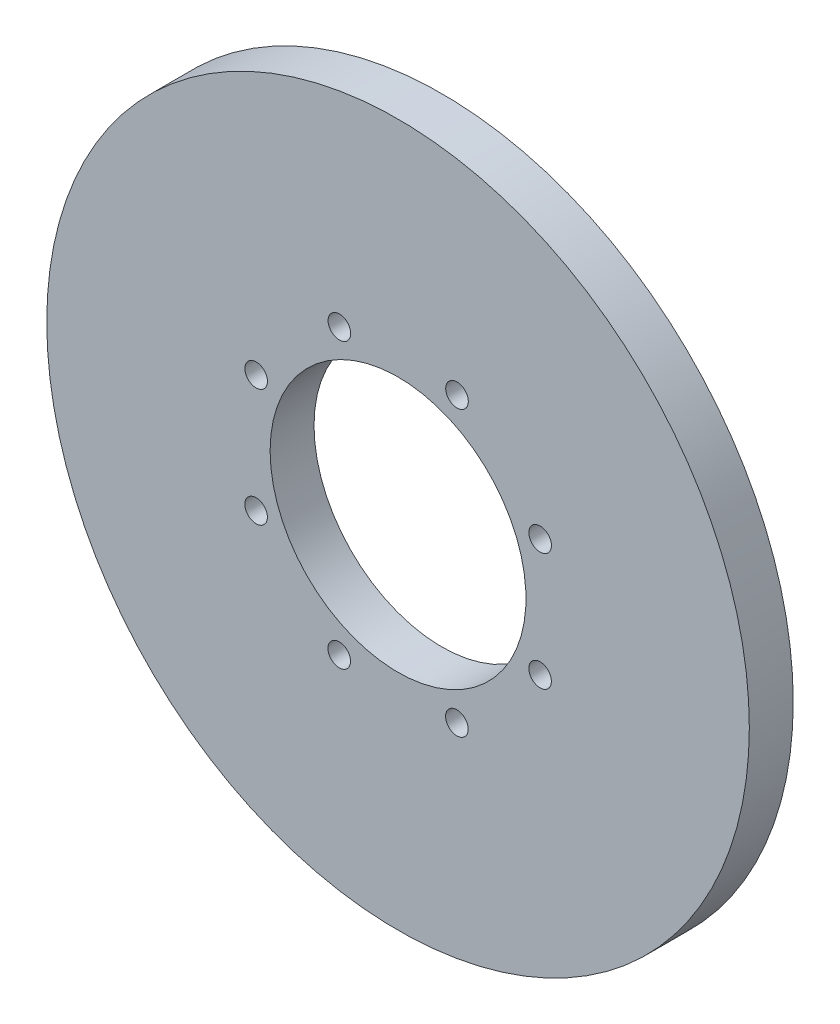
ISO-10303-21;
HEADER;
FILE_DESCRIPTION(('STEP AP214'),'2;1');
FILE_NAME('part.step','',(''),(''),'','','');
FILE_SCHEMA(('AUTOMOTIVE_DESIGN { 1 0 10303 214 1 1 1 1 }'));
ENDSEC;
DATA;
#1=APPLICATION_CONTEXT('core data for automotive mechanical design processes');
#2=APPLICATION_PROTOCOL_DEFINITION('international standard','automotive_design',2000,#1);
#3=PRODUCT_CONTEXT('',#1,'mechanical');
#4=PRODUCT('Part','Part','',(#3));
#5=PRODUCT_RELATED_PRODUCT_CATEGORY('part','',(#4));
#6=PRODUCT_DEFINITION_FORMATION('','',#4);
#7=PRODUCT_DEFINITION_CONTEXT('part definition',#1,'design');
#8=PRODUCT_DEFINITION('design','',#6,#7);
#9=PRODUCT_DEFINITION_SHAPE('','',#8);
#10=(LENGTH_UNIT() NAMED_UNIT(*) SI_UNIT(.MILLI.,.METRE.));
#11=(NAMED_UNIT(*) PLANE_ANGLE_UNIT() SI_UNIT($,.RADIAN.));
#12=(NAMED_UNIT(*) SI_UNIT($,.STERADIAN.) SOLID_ANGLE_UNIT());
#13=UNCERTAINTY_MEASURE_WITH_UNIT(LENGTH_MEASURE(1.E-05),#10,'distance_accuracy_value','');
#14=(GEOMETRIC_REPRESENTATION_CONTEXT(3) GLOBAL_UNCERTAINTY_ASSIGNED_CONTEXT((#13)) GLOBAL_UNIT_ASSIGNED_CONTEXT((#10,
#11,#12)) REPRESENTATION_CONTEXT('',''));
#15=CARTESIAN_POINT('',(0.,0.,0.));
#16=DIRECTION('',(0.,0.,1.));
#17=DIRECTION('',(1.,0.,0.));
#18=AXIS2_PLACEMENT_3D('',#15,#16,#17);
#19=CARTESIAN_POINT('',(0.,0.,19.05));
#20=DIRECTION('',(0.,0.,-1.));
#21=DIRECTION('',(-1.,0.,0.));
#22=AXIS2_PLACEMENT_3D('',#19,#20,#21);
#23=CYLINDRICAL_SURFACE('',#22,152.4);
#24=CARTESIAN_POINT('',(0.,0.,19.05));
#25=DIRECTION('',(0.,0.,1.));
#26=DIRECTION('',(1.,0.,0.));
#27=AXIS2_PLACEMENT_3D('',#24,#25,#26);
#28=CIRCLE('',#27,152.4);
#29=CARTESIAN_POINT('',(-152.4,0.,19.05));
#30=VERTEX_POINT('',#29);
#31=EDGE_CURVE('E11',#30,#30,#28,.T.);
#32=CARTESIAN_POINT('',(0.,0.,0.));
#33=DIRECTION('',(0.,0.,1.));
#34=DIRECTION('',(1.,0.,0.));
#35=AXIS2_PLACEMENT_3D('',#32,#33,#34);
#36=CIRCLE('',#35,152.4);
#37=CARTESIAN_POINT('',(-152.4,0.,0.));
#38=VERTEX_POINT('',#37);
#39=EDGE_CURVE('E40',#38,#38,#36,.T.);
#40=CARTESIAN_POINT('',(-152.4,0.,19.05));
#41=CARTESIAN_POINT('',(-152.4,0.,18.8515625));
#42=CARTESIAN_POINT('',(-152.4,0.,18.653125));
#43=CARTESIAN_POINT('',(-152.4,0.,18.25625));
#44=CARTESIAN_POINT('',(-152.4,0.,18.0578125));
#45=CARTESIAN_POINT('',(-152.4,0.,17.6609375));
#46=CARTESIAN_POINT('',(-152.4,0.,17.4625));
#47=CARTESIAN_POINT('',(-152.4,0.,17.065625));
#48=CARTESIAN_POINT('',(-152.4,0.,16.8671875));
#49=CARTESIAN_POINT('',(-152.4,0.,16.4703125));
#50=CARTESIAN_POINT('',(-152.4,0.,16.271875));
#51=CARTESIAN_POINT('',(-152.4,0.,15.875));
#52=CARTESIAN_POINT('',(-152.4,0.,15.6765625));
#53=CARTESIAN_POINT('',(-152.4,0.,15.2796875));
#54=CARTESIAN_POINT('',(-152.4,0.,15.08125));
#55=CARTESIAN_POINT('',(-152.4,0.,14.684375));
#56=CARTESIAN_POINT('',(-152.4,0.,14.4859375));
#57=CARTESIAN_POINT('',(-152.4,0.,14.0890625));
#58=CARTESIAN_POINT('',(-152.4,0.,13.890625));
#59=CARTESIAN_POINT('',(-152.4,0.,13.49375));
#60=CARTESIAN_POINT('',(-152.4,0.,13.2953125));
#61=CARTESIAN_POINT('',(-152.4,0.,12.8984375));
#62=CARTESIAN_POINT('',(-152.4,0.,12.7));
#63=CARTESIAN_POINT('',(-152.4,0.,12.303125));
#64=CARTESIAN_POINT('',(-152.4,0.,12.1046875));
#65=CARTESIAN_POINT('',(-152.4,0.,11.7078125));
#66=CARTESIAN_POINT('',(-152.4,0.,11.509375));
#67=CARTESIAN_POINT('',(-152.4,0.,11.1125));
#68=CARTESIAN_POINT('',(-152.4,0.,10.9140625));
#69=CARTESIAN_POINT('',(-152.4,0.,10.5171875));
#70=CARTESIAN_POINT('',(-152.4,0.,10.31875));
#71=CARTESIAN_POINT('',(-152.4,0.,9.921875));
#72=CARTESIAN_POINT('',(-152.4,0.,9.7234375));
#73=CARTESIAN_POINT('',(-152.4,0.,9.3265625));
#74=CARTESIAN_POINT('',(-152.4,0.,9.128125));
#75=CARTESIAN_POINT('',(-152.4,0.,8.73125));
#76=CARTESIAN_POINT('',(-152.4,0.,8.5328125));
#77=CARTESIAN_POINT('',(-152.4,0.,8.1359375));
#78=CARTESIAN_POINT('',(-152.4,0.,7.9375));
#79=CARTESIAN_POINT('',(-152.4,0.,7.540625));
#80=CARTESIAN_POINT('',(-152.4,0.,7.3421875));
#81=CARTESIAN_POINT('',(-152.4,0.,6.9453125));
#82=CARTESIAN_POINT('',(-152.4,0.,6.746875));
#83=CARTESIAN_POINT('',(-152.4,0.,6.35));
#84=CARTESIAN_POINT('',(-152.4,0.,6.1515625));
#85=CARTESIAN_POINT('',(-152.4,0.,5.7546875));
#86=CARTESIAN_POINT('',(-152.4,0.,5.55625));
#87=CARTESIAN_POINT('',(-152.4,0.,5.159375));
#88=CARTESIAN_POINT('',(-152.4,0.,4.9609375));
#89=CARTESIAN_POINT('',(-152.4,0.,4.5640625));
#90=CARTESIAN_POINT('',(-152.4,0.,4.365625));
#91=CARTESIAN_POINT('',(-152.4,0.,3.96875));
#92=CARTESIAN_POINT('',(-152.4,0.,3.7703125));
#93=CARTESIAN_POINT('',(-152.4,0.,3.3734375));
#94=CARTESIAN_POINT('',(-152.4,0.,3.175));
#95=CARTESIAN_POINT('',(-152.4,0.,2.778125));
#96=CARTESIAN_POINT('',(-152.4,0.,2.5796875));
#97=CARTESIAN_POINT('',(-152.4,0.,2.1828125));
#98=CARTESIAN_POINT('',(-152.4,0.,1.984375));
#99=CARTESIAN_POINT('',(-152.4,0.,1.5875));
#100=CARTESIAN_POINT('',(-152.4,0.,1.3890625));
#101=CARTESIAN_POINT('',(-152.4,0.,0.992187500000001));
#102=CARTESIAN_POINT('',(-152.4,0.,0.793750000000001));
#103=CARTESIAN_POINT('',(-152.4,0.,0.396875));
#104=CARTESIAN_POINT('',(-152.4,0.,0.1984375));
#105=CARTESIAN_POINT('',(-152.4,0.,0.));
#106=B_SPLINE_CURVE_WITH_KNOTS('',3,(#40,#41,#42,#43,#44,#45,#46,#47,#48,#49,#50,#51,#52,#53,
#54,#55,#56,#57,#58,#59,#60,#61,#62,#63,#64,#65,#66,#67,#68,#69,#70,#71,#72,#73,#74,#75,#76,#77,
#78,#79,#80,#81,#82,#83,#84,#85,#86,#87,#88,#89,#90,#91,#92,#93,#94,#95,#96,#97,#98,#99,#100,
#101,#102,#103,#104,#105),.UNSPECIFIED.,.F.,.F.,(4,2,2,2,2,2,2,2,2,2,2,2,2,2,2,2,2,2,2,2,2,2,2,
2,2,2,2,2,2,2,2,2,4),(0.,0.5953125,1.190625,1.7859375,2.38125,2.9765625,3.571875,4.1671875,
4.7625,5.3578125,5.953125,6.5484375,7.14375,7.7390625,8.334375,8.9296875,9.525,10.1203125,
10.715625,11.3109375,11.90625,12.5015625,13.096875,13.6921875,14.2875,14.8828125,15.478125,
16.0734375,16.66875,17.2640625,17.859375,18.4546875,19.05),.UNSPECIFIED.);
#107=EDGE_CURVE('BSEAM32',#30,#38,#106,.T.);
#108=ORIENTED_EDGE('',*,*,#31,.F.);
#109=ORIENTED_EDGE('',*,*,#39,.T.);
#110=ORIENTED_EDGE('',*,*,#107,.T.);
#111=ORIENTED_EDGE('',*,*,#107,.F.);
#112=EDGE_LOOP('',(#108,#110,#109,#111));
#113=FACE_BOUND('',#112,.T.);
#114=ADVANCED_FACE('F32',(#113),#23,.T.);
#115=CARTESIAN_POINT('',(0.,0.,19.05));
#116=DIRECTION('',(0.,0.,1.));
#117=DIRECTION('',(1.,0.,0.));
#118=AXIS2_PLACEMENT_3D('',#115,#116,#117);
#119=PLANE('',#118);
#120=CARTESIAN_POINT('',(25.5239739587026,-61.6730280447129,19.05));
#121=DIRECTION('',(0.,0.,1.));
#122=DIRECTION('',(1.,0.,0.));
#123=AXIS2_PLACEMENT_3D('',#120,#121,#122);
#124=CIRCLE('',#123,4.90219999999999);
#125=CARTESIAN_POINT('',(30.4261739587026,-61.6730280447129,19.05));
#126=VERTEX_POINT('',#125);
#127=EDGE_CURVE('E103',#126,#126,#124,.T.);
#128=ORIENTED_EDGE('',*,*,#127,.F.);
#129=EDGE_LOOP('',(#128));
#130=FACE_BOUND('',#129,.T.);
#131=CARTESIAN_POINT('',(61.6247346491195,-25.605296338737,19.05));
#132=DIRECTION('',(0.,0.,1.));
#133=DIRECTION('',(1.,0.,0.));
#134=AXIS2_PLACEMENT_3D('',#131,#132,#133);
#135=CIRCLE('',#134,4.90219999999998);
#136=CARTESIAN_POINT('',(66.5269346491195,-25.605296338737,19.05));
#137=VERTEX_POINT('',#136);
#138=EDGE_CURVE('E97',#137,#137,#135,.T.);
#139=ORIENTED_EDGE('',*,*,#138,.F.);
#140=EDGE_LOOP('',(#139));
#141=FACE_BOUND('',#140,.T.);
#142=CARTESIAN_POINT('',(61.6480896679934,25.4255340227622,19.05));
#143=DIRECTION('',(0.,0.,1.));
#144=DIRECTION('',(1.,0.,0.));
#145=AXIS2_PLACEMENT_3D('',#142,#143,#144);
#146=CIRCLE('',#145,4.90219999999999);
#147=CARTESIAN_POINT('',(66.5502896679934,25.4255340227622,19.05));
#148=VERTEX_POINT('',#147);
#149=EDGE_CURVE('E91',#148,#148,#146,.T.);
#150=ORIENTED_EDGE('',*,*,#149,.F.);
#151=EDGE_LOOP('',(#150));
#152=FACE_BOUND('',#151,.T.);
#153=CARTESIAN_POINT('',(25.5803579620182,61.5262947131786,19.05));
#154=DIRECTION('',(0.,0.,1.));
#155=DIRECTION('',(1.,0.,0.));
#156=AXIS2_PLACEMENT_3D('',#153,#154,#155);
#157=CIRCLE('',#156,4.90219999999999);
#158=CARTESIAN_POINT('',(30.4825579620182,61.5262947131786,19.05));
#159=VERTEX_POINT('',#158);
#160=EDGE_CURVE('E85',#159,#159,#157,.T.);
#161=ORIENTED_EDGE('',*,*,#160,.F.);
#162=EDGE_LOOP('',(#161));
#163=FACE_BOUND('',#162,.T.);
#164=CARTESIAN_POINT('',(-25.4504723994809,61.5496497320531,19.05));
#165=DIRECTION('',(0.,0.,1.));
#166=DIRECTION('',(1.,0.,0.));
#167=AXIS2_PLACEMENT_3D('',#164,#165,#166);
#168=CIRCLE('',#167,4.90219999999999);
#169=CARTESIAN_POINT('',(-20.5482723994809,61.5496497320531,19.05));
#170=VERTEX_POINT('',#169);
#171=EDGE_CURVE('E79',#170,#170,#168,.T.);
#172=ORIENTED_EDGE('',*,*,#171,.F.);
#173=EDGE_LOOP('',(#172));
#174=FACE_BOUND('',#173,.T.);
#175=CARTESIAN_POINT('',(-61.5512330898981,25.4819180260774,19.05));
#176=DIRECTION('',(0.,0.,1.));
#177=DIRECTION('',(1.,0.,0.));
#178=AXIS2_PLACEMENT_3D('',#175,#176,#177);
#179=CIRCLE('',#178,4.90219999999999);
#180=CARTESIAN_POINT('',(-56.6490330898981,25.4819180260774,19.05));
#181=VERTEX_POINT('',#180);
#182=EDGE_CURVE('E73',#181,#181,#179,.T.);
#183=ORIENTED_EDGE('',*,*,#182,.F.);
#184=EDGE_LOOP('',(#183));
#185=FACE_BOUND('',#184,.T.);
#186=CARTESIAN_POINT('',(-61.5745881087722,-25.5489123354222,19.05));
#187=DIRECTION('',(0.,0.,1.));
#188=DIRECTION('',(1.,0.,0.));
#189=AXIS2_PLACEMENT_3D('',#186,#187,#188);
#190=CIRCLE('',#189,4.90219999999999);
#191=CARTESIAN_POINT('',(-56.6723881087722,-25.5489123354222,19.05));
#192=VERTEX_POINT('',#191);
#193=EDGE_CURVE('E65',#192,#192,#190,.T.);
#194=ORIENTED_EDGE('',*,*,#193,.F.);
#195=EDGE_LOOP('',(#194));
#196=FACE_BOUND('',#195,.T.);
#197=CARTESIAN_POINT('',(-25.5068564027966,-61.6496730258388,19.05));
#198=DIRECTION('',(0.,0.,1.));
#199=DIRECTION('',(1.,0.,0.));
#200=AXIS2_PLACEMENT_3D('',#197,#198,#199);
#201=CIRCLE('',#200,4.90219999999999);
#202=CARTESIAN_POINT('',(-20.6046564027966,-61.6496730258388,19.05));
#203=VERTEX_POINT('',#202);
#204=EDGE_CURVE('E57',#203,#203,#201,.T.);
#205=ORIENTED_EDGE('',*,*,#204,.F.);
#206=EDGE_LOOP('',(#205));
#207=FACE_BOUND('',#206,.T.);
#208=CARTESIAN_POINT('',(0.,0.,19.05));
#209=DIRECTION('',(0.,0.,1.));
#210=DIRECTION('',(1.,0.,0.));
#211=AXIS2_PLACEMENT_3D('',#208,#209,#210);
#212=CIRCLE('',#211,55.5);
#213=CARTESIAN_POINT('',(-55.5,0.,19.05));
#214=VERTEX_POINT('',#213);
#215=EDGE_CURVE('E45',#214,#214,#212,.F.);
#216=ORIENTED_EDGE('',*,*,#215,.T.);
#217=EDGE_LOOP('',(#216));
#218=FACE_BOUND('',#217,.T.);
#219=ORIENTED_EDGE('',*,*,#31,.T.);
#220=EDGE_LOOP('',(#219));
#221=FACE_BOUND('',#220,.T.);
#222=ADVANCED_FACE('F109',(#130,#141,#152,#163,#174,#185,#196,#207,#218,#221),#119,.T.);
#223=CARTESIAN_POINT('',(0.,0.,0.));
#224=DIRECTION('',(0.,0.,1.));
#225=DIRECTION('',(1.,0.,0.));
#226=AXIS2_PLACEMENT_3D('',#223,#224,#225);
#227=PLANE('',#226);
#228=CARTESIAN_POINT('',(25.5239739587026,-61.6730280447129,0.));
#229=DIRECTION('',(0.,0.,1.));
#230=DIRECTION('',(1.,0.,0.));
#231=AXIS2_PLACEMENT_3D('',#228,#229,#230);
#232=CIRCLE('',#231,4.9022);
#233=CARTESIAN_POINT('',(30.4261739587026,-61.6730280447129,0.));
#234=VERTEX_POINT('',#233);
#235=EDGE_CURVE('E100',#234,#234,#232,.T.);
#236=ORIENTED_EDGE('',*,*,#235,.T.);
#237=EDGE_LOOP('',(#236));
#238=FACE_BOUND('',#237,.T.);
#239=CARTESIAN_POINT('',(61.6247346491195,-25.605296338737,0.));
#240=DIRECTION('',(0.,0.,1.));
#241=DIRECTION('',(1.,0.,0.));
#242=AXIS2_PLACEMENT_3D('',#239,#240,#241);
#243=CIRCLE('',#242,4.9022);
#244=CARTESIAN_POINT('',(66.5269346491195,-25.605296338737,0.));
#245=VERTEX_POINT('',#244);
#246=EDGE_CURVE('E94',#245,#245,#243,.T.);
#247=ORIENTED_EDGE('',*,*,#246,.T.);
#248=EDGE_LOOP('',(#247));
#249=FACE_BOUND('',#248,.T.);
#250=CARTESIAN_POINT('',(61.6480896679934,25.4255340227622,0.));
#251=DIRECTION('',(0.,0.,1.));
#252=DIRECTION('',(1.,0.,0.));
#253=AXIS2_PLACEMENT_3D('',#250,#251,#252);
#254=CIRCLE('',#253,4.90219999999999);
#255=CARTESIAN_POINT('',(66.5502896679934,25.4255340227622,0.));
#256=VERTEX_POINT('',#255);
#257=EDGE_CURVE('E88',#256,#256,#254,.T.);
#258=ORIENTED_EDGE('',*,*,#257,.T.);
#259=EDGE_LOOP('',(#258));
#260=FACE_BOUND('',#259,.T.);
#261=CARTESIAN_POINT('',(25.5803579620182,61.5262947131786,0.));
#262=DIRECTION('',(0.,0.,1.));
#263=DIRECTION('',(1.,0.,0.));
#264=AXIS2_PLACEMENT_3D('',#261,#262,#263);
#265=CIRCLE('',#264,4.9022);
#266=CARTESIAN_POINT('',(30.4825579620182,61.5262947131786,0.));
#267=VERTEX_POINT('',#266);
#268=EDGE_CURVE('E82',#267,#267,#265,.T.);
#269=ORIENTED_EDGE('',*,*,#268,.T.);
#270=EDGE_LOOP('',(#269));
#271=FACE_BOUND('',#270,.T.);
#272=CARTESIAN_POINT('',(-25.4504723994809,61.5496497320531,0.));
#273=DIRECTION('',(0.,0.,1.));
#274=DIRECTION('',(1.,0.,0.));
#275=AXIS2_PLACEMENT_3D('',#272,#273,#274);
#276=CIRCLE('',#275,4.9022);
#277=CARTESIAN_POINT('',(-20.5482723994809,61.5496497320531,0.));
#278=VERTEX_POINT('',#277);
#279=EDGE_CURVE('E76',#278,#278,#276,.T.);
#280=ORIENTED_EDGE('',*,*,#279,.T.);
#281=EDGE_LOOP('',(#280));
#282=FACE_BOUND('',#281,.T.);
#283=CARTESIAN_POINT('',(-61.5512330898981,25.4819180260774,0.));
#284=DIRECTION('',(0.,0.,1.));
#285=DIRECTION('',(1.,0.,0.));
#286=AXIS2_PLACEMENT_3D('',#283,#284,#285);
#287=CIRCLE('',#286,4.9022);
#288=CARTESIAN_POINT('',(-56.6490330898981,25.4819180260774,0.));
#289=VERTEX_POINT('',#288);
#290=EDGE_CURVE('E70',#289,#289,#287,.T.);
#291=ORIENTED_EDGE('',*,*,#290,.T.);
#292=EDGE_LOOP('',(#291));
#293=FACE_BOUND('',#292,.T.);
#294=CARTESIAN_POINT('',(-61.5745881087722,-25.5489123354222,0.));
#295=DIRECTION('',(0.,0.,1.));
#296=DIRECTION('',(1.,0.,0.));
#297=AXIS2_PLACEMENT_3D('',#294,#295,#296);
#298=CIRCLE('',#297,4.9022);
#299=CARTESIAN_POINT('',(-56.6723881087722,-25.5489123354222,0.));
#300=VERTEX_POINT('',#299);
#301=EDGE_CURVE('E61',#300,#300,#298,.T.);
#302=ORIENTED_EDGE('',*,*,#301,.T.);
#303=EDGE_LOOP('',(#302));
#304=FACE_BOUND('',#303,.T.);
#305=CARTESIAN_POINT('',(-25.5068564027966,-61.6496730258388,0.));
#306=DIRECTION('',(0.,0.,1.));
#307=DIRECTION('',(1.,0.,0.));
#308=AXIS2_PLACEMENT_3D('',#305,#306,#307);
#309=CIRCLE('',#308,4.9022);
#310=CARTESIAN_POINT('',(-20.6046564027966,-61.6496730258388,0.));
#311=VERTEX_POINT('',#310);
#312=EDGE_CURVE('E48',#311,#311,#309,.T.);
#313=ORIENTED_EDGE('',*,*,#312,.T.);
#314=EDGE_LOOP('',(#313));
#315=FACE_BOUND('',#314,.T.);
#316=CARTESIAN_POINT('',(0.,0.,0.));
#317=DIRECTION('',(0.,0.,1.));
#318=DIRECTION('',(1.,0.,0.));
#319=AXIS2_PLACEMENT_3D('',#316,#317,#318);
#320=CIRCLE('',#319,55.5);
#321=CARTESIAN_POINT('',(-55.5,0.,0.));
#322=VERTEX_POINT('',#321);
#323=EDGE_CURVE('E36',#322,#322,#320,.F.);
#324=ORIENTED_EDGE('',*,*,#323,.F.);
#325=EDGE_LOOP('',(#324));
#326=FACE_BOUND('',#325,.T.);
#327=ORIENTED_EDGE('',*,*,#39,.F.);
#328=EDGE_LOOP('',(#327));
#329=FACE_BOUND('',#328,.T.);
#330=ADVANCED_FACE('F112',(#238,#249,#260,#271,#282,#293,#304,#315,#326,#329),#227,.F.);
#331=CARTESIAN_POINT('',(0.,0.,19.05));
#332=DIRECTION('',(0.,0.,-1.));
#333=DIRECTION('',(-1.,0.,0.));
#334=AXIS2_PLACEMENT_3D('',#331,#332,#333);
#335=CYLINDRICAL_SURFACE('',#334,55.5);
#336=CARTESIAN_POINT('',(-55.5,0.,19.05));
#337=CARTESIAN_POINT('',(-55.5,0.,18.8515625));
#338=CARTESIAN_POINT('',(-55.5,0.,18.653125));
#339=CARTESIAN_POINT('',(-55.5,0.,18.25625));
#340=CARTESIAN_POINT('',(-55.5,0.,18.0578125));
#341=CARTESIAN_POINT('',(-55.5,0.,17.6609375));
#342=CARTESIAN_POINT('',(-55.5,0.,17.4625));
#343=CARTESIAN_POINT('',(-55.5,0.,17.065625));
#344=CARTESIAN_POINT('',(-55.5,0.,16.8671875));
#345=CARTESIAN_POINT('',(-55.5,0.,16.4703125));
#346=CARTESIAN_POINT('',(-55.5,0.,16.271875));
#347=CARTESIAN_POINT('',(-55.5,0.,15.875));
#348=CARTESIAN_POINT('',(-55.5,0.,15.6765625));
#349=CARTESIAN_POINT('',(-55.5,0.,15.2796875));
#350=CARTESIAN_POINT('',(-55.5,0.,15.08125));
#351=CARTESIAN_POINT('',(-55.5,0.,14.684375));
#352=CARTESIAN_POINT('',(-55.5,0.,14.4859375));
#353=CARTESIAN_POINT('',(-55.5,0.,14.0890625));
#354=CARTESIAN_POINT('',(-55.5,0.,13.890625));
#355=CARTESIAN_POINT('',(-55.5,0.,13.49375));
#356=CARTESIAN_POINT('',(-55.5,0.,13.2953125));
#357=CARTESIAN_POINT('',(-55.5,0.,12.8984375));
#358=CARTESIAN_POINT('',(-55.5,0.,12.7));
#359=CARTESIAN_POINT('',(-55.5,0.,12.303125));
#360=CARTESIAN_POINT('',(-55.5,0.,12.1046875));
#361=CARTESIAN_POINT('',(-55.5,0.,11.7078125));
#362=CARTESIAN_POINT('',(-55.5,0.,11.509375));
#363=CARTESIAN_POINT('',(-55.5,0.,11.1125));
#364=CARTESIAN_POINT('',(-55.5,0.,10.9140625));
#365=CARTESIAN_POINT('',(-55.5,0.,10.5171875));
#366=CARTESIAN_POINT('',(-55.5,0.,10.31875));
#367=CARTESIAN_POINT('',(-55.5,0.,9.921875));
#368=CARTESIAN_POINT('',(-55.5,0.,9.7234375));
#369=CARTESIAN_POINT('',(-55.5,0.,9.3265625));
#370=CARTESIAN_POINT('',(-55.5,0.,9.128125));
#371=CARTESIAN_POINT('',(-55.5,0.,8.73125));
#372=CARTESIAN_POINT('',(-55.5,0.,8.5328125));
#373=CARTESIAN_POINT('',(-55.5,0.,8.1359375));
#374=CARTESIAN_POINT('',(-55.5,0.,7.9375));
#375=CARTESIAN_POINT('',(-55.5,0.,7.540625));
#376=CARTESIAN_POINT('',(-55.5,0.,7.3421875));
#377=CARTESIAN_POINT('',(-55.5,0.,6.9453125));
#378=CARTESIAN_POINT('',(-55.5,0.,6.746875));
#379=CARTESIAN_POINT('',(-55.5,0.,6.35));
#380=CARTESIAN_POINT('',(-55.5,0.,6.1515625));
#381=CARTESIAN_POINT('',(-55.5,0.,5.7546875));
#382=CARTESIAN_POINT('',(-55.5,0.,5.55625));
#383=CARTESIAN_POINT('',(-55.5,0.,5.159375));
#384=CARTESIAN_POINT('',(-55.5,0.,4.9609375));
#385=CARTESIAN_POINT('',(-55.5,0.,4.5640625));
#386=CARTESIAN_POINT('',(-55.5,0.,4.365625));
#387=CARTESIAN_POINT('',(-55.5,0.,3.96875));
#388=CARTESIAN_POINT('',(-55.5,0.,3.7703125));
#389=CARTESIAN_POINT('',(-55.5,0.,3.3734375));
#390=CARTESIAN_POINT('',(-55.5,0.,3.175));
#391=CARTESIAN_POINT('',(-55.5,0.,2.778125));
#392=CARTESIAN_POINT('',(-55.5,0.,2.5796875));
#393=CARTESIAN_POINT('',(-55.5,0.,2.1828125));
#394=CARTESIAN_POINT('',(-55.5,0.,1.984375));
#395=CARTESIAN_POINT('',(-55.5,0.,1.5875));
#396=CARTESIAN_POINT('',(-55.5,0.,1.3890625));
#397=CARTESIAN_POINT('',(-55.5,0.,0.992187500000001));
#398=CARTESIAN_POINT('',(-55.5,0.,0.793750000000001));
#399=CARTESIAN_POINT('',(-55.5,0.,0.396875));
#400=CARTESIAN_POINT('',(-55.5,0.,0.1984375));
#401=CARTESIAN_POINT('',(-55.5,0.,0.));
#402=B_SPLINE_CURVE_WITH_KNOTS('',3,(#336,#337,#338,#339,#340,#341,#342,#343,#344,#345,#346,
#347,#348,#349,#350,#351,#352,#353,#354,#355,#356,#357,#358,#359,#360,#361,#362,#363,#364,#365,
#366,#367,#368,#369,#370,#371,#372,#373,#374,#375,#376,#377,#378,#379,#380,#381,#382,#383,#384,
#385,#386,#387,#388,#389,#390,#391,#392,#393,#394,#395,#396,#397,#398,#399,#400,#401),
.UNSPECIFIED.,.F.,.F.,(4,2,2,2,2,2,2,2,2,2,2,2,2,2,2,2,2,2,2,2,2,2,2,2,2,2,2,2,2,2,2,2,4),(0.,
0.595312499999997,1.190625,1.7859375,2.38125,2.9765625,3.571875,4.1671875,4.7625,5.3578125,
5.953125,6.5484375,7.14375,7.7390625,8.334375,8.9296875,9.525,10.1203125,10.715625,11.3109375,
11.90625,12.5015625,13.096875,13.6921875,14.2875,14.8828125,15.478125,16.0734375,16.66875,
17.2640625,17.859375,18.4546875,19.05),.UNSPECIFIED.);
#403=EDGE_CURVE('BSEAM34',#214,#322,#402,.T.);
#404=ORIENTED_EDGE('',*,*,#215,.F.);
#405=ORIENTED_EDGE('',*,*,#323,.T.);
#406=ORIENTED_EDGE('',*,*,#403,.T.);
#407=ORIENTED_EDGE('',*,*,#403,.F.);
#408=EDGE_LOOP('',(#404,#406,#405,#407));
#409=FACE_BOUND('',#408,.T.);
#410=ADVANCED_FACE('F34',(#409),#335,.F.);
#411=CARTESIAN_POINT('',(-25.5068564027966,-61.6496730258388,19.05));
#412=DIRECTION('',(0.,0.,1.));
#413=DIRECTION('',(1.,0.,0.));
#414=AXIS2_PLACEMENT_3D('',#411,#412,#413);
#415=CYLINDRICAL_SURFACE('',#414,4.90219999999999);
#416=ORIENTED_EDGE('',*,*,#312,.F.);
#417=EDGE_LOOP('',(#416));
#418=FACE_BOUND('',#417,.T.);
#419=ORIENTED_EDGE('',*,*,#204,.T.);
#420=EDGE_LOOP('',(#419));
#421=FACE_BOUND('',#420,.T.);
#422=ADVANCED_FACE('F130',(#418,#421),#415,.F.);
#423=CARTESIAN_POINT('',(-61.5745881087722,-25.5489123354222,19.05));
#424=DIRECTION('',(0.,0.,1.));
#425=DIRECTION('',(1.,0.,0.));
#426=AXIS2_PLACEMENT_3D('',#423,#424,#425);
#427=CYLINDRICAL_SURFACE('',#426,4.90219999999999);
#428=ORIENTED_EDGE('',*,*,#301,.F.);
#429=EDGE_LOOP('',(#428));
#430=FACE_BOUND('',#429,.T.);
#431=ORIENTED_EDGE('',*,*,#193,.T.);
#432=EDGE_LOOP('',(#431));
#433=FACE_BOUND('',#432,.T.);
#434=ADVANCED_FACE('F127',(#430,#433),#427,.F.);
#435=CARTESIAN_POINT('',(-61.5512330898981,25.4819180260774,19.05));
#436=DIRECTION('',(0.,0.,1.));
#437=DIRECTION('',(1.,0.,0.));
#438=AXIS2_PLACEMENT_3D('',#435,#436,#437);
#439=CYLINDRICAL_SURFACE('',#438,4.90219999999999);
#440=ORIENTED_EDGE('',*,*,#290,.F.);
#441=EDGE_LOOP('',(#440));
#442=FACE_BOUND('',#441,.T.);
#443=ORIENTED_EDGE('',*,*,#182,.T.);
#444=EDGE_LOOP('',(#443));
#445=FACE_BOUND('',#444,.T.);
#446=ADVANCED_FACE('F129',(#442,#445),#439,.F.);
#447=CARTESIAN_POINT('',(-25.4504723994809,61.5496497320531,19.05));
#448=DIRECTION('',(0.,0.,1.));
#449=DIRECTION('',(1.,0.,0.));
#450=AXIS2_PLACEMENT_3D('',#447,#448,#449);
#451=CYLINDRICAL_SURFACE('',#450,4.90219999999999);
#452=ORIENTED_EDGE('',*,*,#279,.F.);
#453=EDGE_LOOP('',(#452));
#454=FACE_BOUND('',#453,.T.);
#455=ORIENTED_EDGE('',*,*,#171,.T.);
#456=EDGE_LOOP('',(#455));
#457=FACE_BOUND('',#456,.T.);
#458=ADVANCED_FACE('F137',(#454,#457),#451,.F.);
#459=CARTESIAN_POINT('',(25.5803579620182,61.5262947131786,19.05));
#460=DIRECTION('',(0.,0.,1.));
#461=DIRECTION('',(1.,0.,0.));
#462=AXIS2_PLACEMENT_3D('',#459,#460,#461);
#463=CYLINDRICAL_SURFACE('',#462,4.90219999999999);
#464=ORIENTED_EDGE('',*,*,#268,.F.);
#465=EDGE_LOOP('',(#464));
#466=FACE_BOUND('',#465,.T.);
#467=ORIENTED_EDGE('',*,*,#160,.T.);
#468=EDGE_LOOP('',(#467));
#469=FACE_BOUND('',#468,.T.);
#470=ADVANCED_FACE('F174',(#466,#469),#463,.F.);
#471=CARTESIAN_POINT('',(61.6480896679934,25.4255340227622,19.05));
#472=DIRECTION('',(0.,0.,1.));
#473=DIRECTION('',(1.,0.,0.));
#474=AXIS2_PLACEMENT_3D('',#471,#472,#473);
#475=CYLINDRICAL_SURFACE('',#474,4.90219999999999);
#476=ORIENTED_EDGE('',*,*,#257,.F.);
#477=EDGE_LOOP('',(#476));
#478=FACE_BOUND('',#477,.T.);
#479=ORIENTED_EDGE('',*,*,#149,.T.);
#480=EDGE_LOOP('',(#479));
#481=FACE_BOUND('',#480,.T.);
#482=ADVANCED_FACE('F179',(#478,#481),#475,.F.);
#483=CARTESIAN_POINT('',(61.6247346491195,-25.605296338737,19.05));
#484=DIRECTION('',(0.,0.,1.));
#485=DIRECTION('',(1.,0.,0.));
#486=AXIS2_PLACEMENT_3D('',#483,#484,#485);
#487=CYLINDRICAL_SURFACE('',#486,4.90219999999999);
#488=ORIENTED_EDGE('',*,*,#246,.F.);
#489=EDGE_LOOP('',(#488));
#490=FACE_BOUND('',#489,.T.);
#491=ORIENTED_EDGE('',*,*,#138,.T.);
#492=EDGE_LOOP('',(#491));
#493=FACE_BOUND('',#492,.T.);
#494=ADVANCED_FACE('F185',(#490,#493),#487,.F.);
#495=CARTESIAN_POINT('',(25.5239739587026,-61.6730280447129,19.05));
#496=DIRECTION('',(0.,0.,1.));
#497=DIRECTION('',(1.,0.,0.));
#498=AXIS2_PLACEMENT_3D('',#495,#496,#497);
#499=CYLINDRICAL_SURFACE('',#498,4.90219999999999);
#500=ORIENTED_EDGE('',*,*,#235,.F.);
#501=EDGE_LOOP('',(#500));
#502=FACE_BOUND('',#501,.T.);
#503=ORIENTED_EDGE('',*,*,#127,.T.);
#504=EDGE_LOOP('',(#503));
#505=FACE_BOUND('',#504,.T.);
#506=ADVANCED_FACE('F107',(#502,#505),#499,.F.);
#507=CLOSED_SHELL('',(#114,#222,#330,#410,#422,#434,#446,#458,#470,#482,#494,#506));
#508=MANIFOLD_SOLID_BREP('B2',#507);
#509=ADVANCED_BREP_SHAPE_REPRESENTATION('',(#18,#508),#14);
#510=SHAPE_DEFINITION_REPRESENTATION(#9,#509);
ENDSEC;
END-ISO-10303-21;
